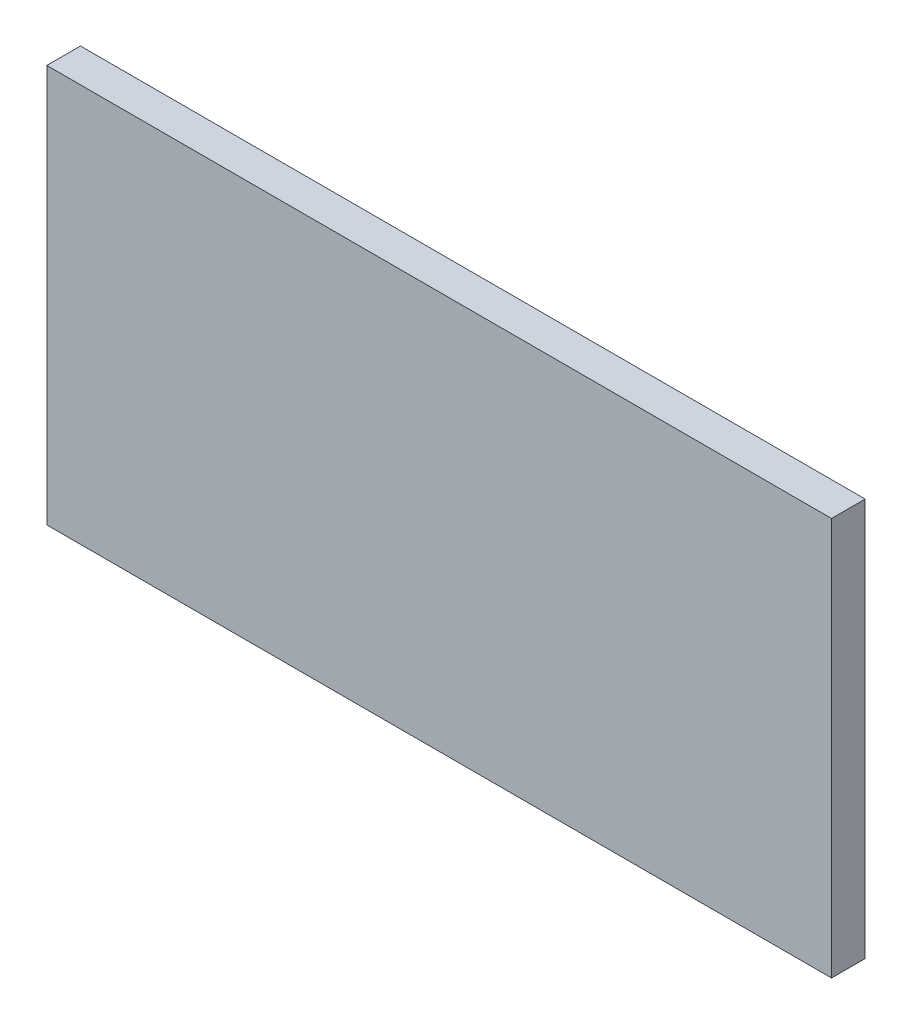
ISO-10303-21;
HEADER;
FILE_DESCRIPTION(('STEP AP214'),'2;1');
FILE_NAME('part.step','',(''),(''),'','','');
FILE_SCHEMA(('AUTOMOTIVE_DESIGN { 1 0 10303 214 1 1 1 1 }'));
ENDSEC;
DATA;
#1=APPLICATION_CONTEXT('core data for automotive mechanical design processes');
#2=APPLICATION_PROTOCOL_DEFINITION('international standard','automotive_design',2000,#1);
#3=PRODUCT_CONTEXT('',#1,'mechanical');
#4=PRODUCT('Part','Part','',(#3));
#5=PRODUCT_RELATED_PRODUCT_CATEGORY('part','',(#4));
#6=PRODUCT_DEFINITION_FORMATION('','',#4);
#7=PRODUCT_DEFINITION_CONTEXT('part definition',#1,'design');
#8=PRODUCT_DEFINITION('design','',#6,#7);
#9=PRODUCT_DEFINITION_SHAPE('','',#8);
#10=(LENGTH_UNIT() NAMED_UNIT(*) SI_UNIT(.MILLI.,.METRE.));
#11=(NAMED_UNIT(*) PLANE_ANGLE_UNIT() SI_UNIT($,.RADIAN.));
#12=(NAMED_UNIT(*) SI_UNIT($,.STERADIAN.) SOLID_ANGLE_UNIT());
#13=UNCERTAINTY_MEASURE_WITH_UNIT(LENGTH_MEASURE(1.E-05),#10,'distance_accuracy_value','');
#14=(GEOMETRIC_REPRESENTATION_CONTEXT(3) GLOBAL_UNCERTAINTY_ASSIGNED_CONTEXT((#13)) GLOBAL_UNIT_ASSIGNED_CONTEXT((#10,
#11,#12)) REPRESENTATION_CONTEXT('',''));
#15=CARTESIAN_POINT('',(0.,0.,0.));
#16=DIRECTION('',(0.,0.,1.));
#17=DIRECTION('',(1.,0.,0.));
#18=AXIS2_PLACEMENT_3D('',#15,#16,#17);
#19=CARTESIAN_POINT('',(-700.,-355.,60.));
#20=DIRECTION('',(1.,0.,0.));
#21=DIRECTION('',(0.,0.,-1.));
#22=AXIS2_PLACEMENT_3D('',#19,#20,#21);
#23=PLANE('',#22);
#24=DIRECTION('',(0.,-1.,0.));
#25=VECTOR('',#24,1.);
#26=CARTESIAN_POINT('',(-700.,-355.,0.));
#27=LINE('',#26,#25);
#28=CARTESIAN_POINT('',(-700.,355.,0.));
#29=VERTEX_POINT('',#28);
#30=CARTESIAN_POINT('',(-700.,-355.,0.));
#31=VERTEX_POINT('',#30);
#32=EDGE_CURVE('E96',#29,#31,#27,.T.);
#33=ORIENTED_EDGE('',*,*,#32,.T.);
#34=DIRECTION('',(0.,0.,-1.));
#35=VECTOR('',#34,1.);
#36=CARTESIAN_POINT('',(-700.,-355.,60.));
#37=LINE('',#36,#35);
#38=CARTESIAN_POINT('',(-700.,-355.,60.));
#39=VERTEX_POINT('',#38);
#40=EDGE_CURVE('E11',#39,#31,#37,.T.);
#41=ORIENTED_EDGE('',*,*,#40,.F.);
#42=DIRECTION('',(0.,-1.,0.));
#43=VECTOR('',#42,1.);
#44=CARTESIAN_POINT('',(-700.,-355.,60.));
#45=LINE('',#44,#43);
#46=CARTESIAN_POINT('',(-700.,355.,60.));
#47=VERTEX_POINT('',#46);
#48=EDGE_CURVE('E84',#47,#39,#45,.T.);
#49=ORIENTED_EDGE('',*,*,#48,.F.);
#50=DIRECTION('',(0.,0.,-1.));
#51=VECTOR('',#50,1.);
#52=CARTESIAN_POINT('',(-700.,355.,60.));
#53=LINE('',#52,#51);
#54=EDGE_CURVE('E92',#47,#29,#53,.T.);
#55=ORIENTED_EDGE('',*,*,#54,.T.);
#56=EDGE_LOOP('',(#33,#41,#49,#55));
#57=FACE_BOUND('',#56,.T.);
#58=ADVANCED_FACE('F33',(#57),#23,.F.);
#59=CARTESIAN_POINT('',(700.,-355.,60.));
#60=DIRECTION('',(0.,1.,0.));
#61=DIRECTION('',(-1.,0.,0.));
#62=AXIS2_PLACEMENT_3D('',#59,#60,#61);
#63=PLANE('',#62);
#64=DIRECTION('',(1.,0.,0.));
#65=VECTOR('',#64,1.);
#66=CARTESIAN_POINT('',(700.,-355.,0.));
#67=LINE('',#66,#65);
#68=CARTESIAN_POINT('',(700.,-355.,0.));
#69=VERTEX_POINT('',#68);
#70=EDGE_CURVE('E88',#31,#69,#67,.T.);
#71=ORIENTED_EDGE('',*,*,#70,.T.);
#72=DIRECTION('',(0.,0.,-1.));
#73=VECTOR('',#72,1.);
#74=CARTESIAN_POINT('',(700.,-355.,60.));
#75=LINE('',#74,#73);
#76=CARTESIAN_POINT('',(700.,-355.,60.));
#77=VERTEX_POINT('',#76);
#78=EDGE_CURVE('E41',#77,#69,#75,.T.);
#79=ORIENTED_EDGE('',*,*,#78,.F.);
#80=DIRECTION('',(1.,0.,0.));
#81=VECTOR('',#80,1.);
#82=CARTESIAN_POINT('',(700.,-355.,60.));
#83=LINE('',#82,#81);
#84=EDGE_CURVE('E79',#39,#77,#83,.T.);
#85=ORIENTED_EDGE('',*,*,#84,.F.);
#86=ORIENTED_EDGE('',*,*,#40,.T.);
#87=EDGE_LOOP('',(#71,#79,#85,#86));
#88=FACE_BOUND('',#87,.T.);
#89=ADVANCED_FACE('F87',(#88),#63,.F.);
#90=CARTESIAN_POINT('',(700.,-355.,60.));
#91=DIRECTION('',(-1.,0.,0.));
#92=DIRECTION('',(0.,0.,1.));
#93=AXIS2_PLACEMENT_3D('',#90,#91,#92);
#94=PLANE('',#93);
#95=DIRECTION('',(0.,1.,0.));
#96=VECTOR('',#95,1.);
#97=CARTESIAN_POINT('',(700.,-355.,0.));
#98=LINE('',#97,#96);
#99=CARTESIAN_POINT('',(700.,355.,0.));
#100=VERTEX_POINT('',#99);
#101=EDGE_CURVE('E66',#69,#100,#98,.T.);
#102=ORIENTED_EDGE('',*,*,#101,.T.);
#103=DIRECTION('',(0.,0.,-1.));
#104=VECTOR('',#103,1.);
#105=CARTESIAN_POINT('',(700.,355.,60.));
#106=LINE('',#105,#104);
#107=CARTESIAN_POINT('',(700.,355.,60.));
#108=VERTEX_POINT('',#107);
#109=EDGE_CURVE('E89',#108,#100,#106,.T.);
#110=ORIENTED_EDGE('',*,*,#109,.F.);
#111=DIRECTION('',(0.,1.,0.));
#112=VECTOR('',#111,1.);
#113=CARTESIAN_POINT('',(700.,-355.,60.));
#114=LINE('',#113,#112);
#115=EDGE_CURVE('E82',#77,#108,#114,.T.);
#116=ORIENTED_EDGE('',*,*,#115,.F.);
#117=ORIENTED_EDGE('',*,*,#78,.T.);
#118=EDGE_LOOP('',(#102,#110,#116,#117));
#119=FACE_BOUND('',#118,.T.);
#120=ADVANCED_FACE('F90',(#119),#94,.F.);
#121=CARTESIAN_POINT('',(700.,355.,60.));
#122=DIRECTION('',(0.,-1.,0.));
#123=DIRECTION('',(1.,0.,0.));
#124=AXIS2_PLACEMENT_3D('',#121,#122,#123);
#125=PLANE('',#124);
#126=DIRECTION('',(-1.,0.,0.));
#127=VECTOR('',#126,1.);
#128=CARTESIAN_POINT('',(700.,355.,0.));
#129=LINE('',#128,#127);
#130=EDGE_CURVE('E72',#100,#29,#129,.T.);
#131=ORIENTED_EDGE('',*,*,#130,.T.);
#132=ORIENTED_EDGE('',*,*,#54,.F.);
#133=DIRECTION('',(-1.,0.,0.));
#134=VECTOR('',#133,1.);
#135=CARTESIAN_POINT('',(700.,355.,60.));
#136=LINE('',#135,#134);
#137=EDGE_CURVE('E49',#108,#47,#136,.T.);
#138=ORIENTED_EDGE('',*,*,#137,.F.);
#139=ORIENTED_EDGE('',*,*,#109,.T.);
#140=EDGE_LOOP('',(#131,#132,#138,#139));
#141=FACE_BOUND('',#140,.T.);
#142=ADVANCED_FACE('F103',(#141),#125,.F.);
#143=CARTESIAN_POINT('',(0.,0.,60.));
#144=DIRECTION('',(0.,0.,1.));
#145=DIRECTION('',(1.,0.,0.));
#146=AXIS2_PLACEMENT_3D('',#143,#144,#145);
#147=PLANE('',#146);
#148=ORIENTED_EDGE('',*,*,#48,.T.);
#149=ORIENTED_EDGE('',*,*,#84,.T.);
#150=ORIENTED_EDGE('',*,*,#115,.T.);
#151=ORIENTED_EDGE('',*,*,#137,.T.);
#152=EDGE_LOOP('',(#148,#149,#150,#151));
#153=FACE_BOUND('',#152,.T.);
#154=ADVANCED_FACE('F80',(#153),#147,.T.);
#155=CARTESIAN_POINT('',(0.,0.,0.));
#156=DIRECTION('',(0.,0.,1.));
#157=DIRECTION('',(1.,0.,0.));
#158=AXIS2_PLACEMENT_3D('',#155,#156,#157);
#159=PLANE('',#158);
#160=ORIENTED_EDGE('',*,*,#32,.F.);
#161=ORIENTED_EDGE('',*,*,#130,.F.);
#162=ORIENTED_EDGE('',*,*,#101,.F.);
#163=ORIENTED_EDGE('',*,*,#70,.F.);
#164=EDGE_LOOP('',(#160,#161,#162,#163));
#165=FACE_BOUND('',#164,.T.);
#166=ADVANCED_FACE('F106',(#165),#159,.F.);
#167=CLOSED_SHELL('',(#58,#89,#120,#142,#154,#166));
#168=MANIFOLD_SOLID_BREP('B2',#167);
#169=ADVANCED_BREP_SHAPE_REPRESENTATION('',(#18,#168),#14);
#170=SHAPE_DEFINITION_REPRESENTATION(#9,#169);
ENDSEC;
END-ISO-10303-21;
